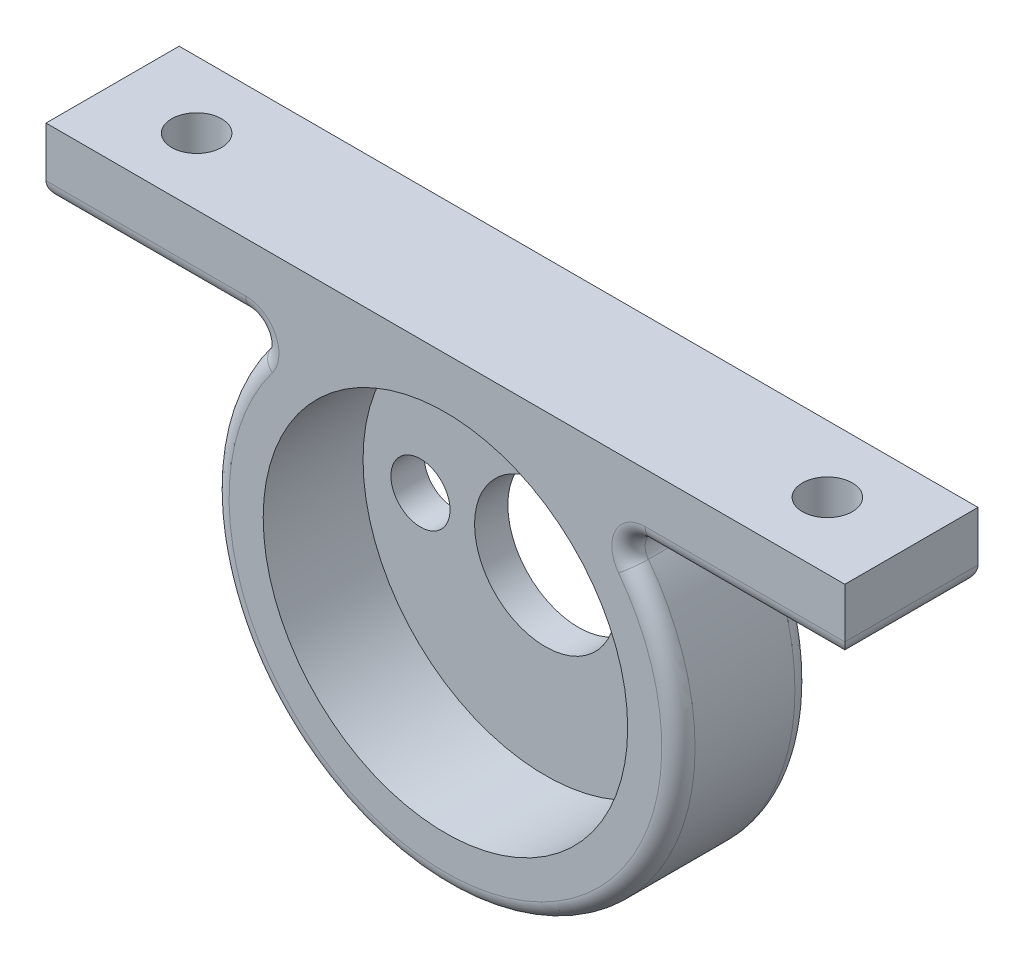
ISO-10303-21;
HEADER;
FILE_DESCRIPTION(('STEP AP214'),'2;1');
FILE_NAME('part.step','',(''),(''),'','','');
FILE_SCHEMA(('AUTOMOTIVE_DESIGN { 1 0 10303 214 1 1 1 1 }'));
ENDSEC;
DATA;
#1=APPLICATION_CONTEXT('core data for automotive mechanical design processes');
#2=APPLICATION_PROTOCOL_DEFINITION('international standard','automotive_design',2000,#1);
#3=PRODUCT_CONTEXT('',#1,'mechanical');
#4=PRODUCT('Part','Part','',(#3));
#5=PRODUCT_RELATED_PRODUCT_CATEGORY('part','',(#4));
#6=PRODUCT_DEFINITION_FORMATION('','',#4);
#7=PRODUCT_DEFINITION_CONTEXT('part definition',#1,'design');
#8=PRODUCT_DEFINITION('design','',#6,#7);
#9=PRODUCT_DEFINITION_SHAPE('','',#8);
#10=(LENGTH_UNIT() NAMED_UNIT(*) SI_UNIT(.MILLI.,.METRE.));
#11=(NAMED_UNIT(*) PLANE_ANGLE_UNIT() SI_UNIT($,.RADIAN.));
#12=(NAMED_UNIT(*) SI_UNIT($,.STERADIAN.) SOLID_ANGLE_UNIT());
#13=UNCERTAINTY_MEASURE_WITH_UNIT(LENGTH_MEASURE(1.E-05),#10,'distance_accuracy_value','');
#14=(GEOMETRIC_REPRESENTATION_CONTEXT(3) GLOBAL_UNCERTAINTY_ASSIGNED_CONTEXT((#13)) GLOBAL_UNIT_ASSIGNED_CONTEXT((#10,
#11,#12)) REPRESENTATION_CONTEXT('',''));
#15=CARTESIAN_POINT('',(0.,0.,0.));
#16=DIRECTION('',(0.,0.,1.));
#17=DIRECTION('',(1.,0.,0.));
#18=AXIS2_PLACEMENT_3D('',#15,#16,#17);
#19=CARTESIAN_POINT('',(0.,0.,8.));
#20=DIRECTION('',(0.,0.,-1.));
#21=DIRECTION('',(-1.,0.,0.));
#22=AXIS2_PLACEMENT_3D('',#19,#20,#21);
#23=CYLINDRICAL_SURFACE('',#22,14.);
#24=CARTESIAN_POINT('',(0.,0.,7.));
#25=DIRECTION('',(0.,0.,1.));
#26=DIRECTION('',(1.,0.,0.));
#27=AXIS2_PLACEMENT_3D('',#24,#25,#26);
#28=CIRCLE('',#27,14.);
#29=CARTESIAN_POINT('',(11.2,8.4,7.));
#30=VERTEX_POINT('',#29);
#31=CARTESIAN_POINT('',(-11.2,8.4,7.));
#32=VERTEX_POINT('',#31);
#33=EDGE_CURVE('E54',#30,#32,#28,.F.);
#34=ORIENTED_EDGE('',*,*,#33,.T.);
#35=DIRECTION('',(0.,0.,-1.));
#36=VECTOR('',#35,1.);
#37=CARTESIAN_POINT('',(-11.2,8.4,8.));
#38=LINE('',#37,#36);
#39=CARTESIAN_POINT('',(-11.2,8.4,1.));
#40=VERTEX_POINT('',#39);
#41=EDGE_CURVE('E209',#32,#40,#38,.T.);
#42=ORIENTED_EDGE('',*,*,#41,.T.);
#43=CARTESIAN_POINT('',(0.,0.,1.));
#44=DIRECTION('',(0.,0.,1.));
#45=DIRECTION('',(1.,0.,0.));
#46=AXIS2_PLACEMENT_3D('',#43,#44,#45);
#47=CIRCLE('',#46,14.);
#48=CARTESIAN_POINT('',(11.2,8.4,1.));
#49=VERTEX_POINT('',#48);
#50=EDGE_CURVE('E205',#40,#49,#47,.T.);
#51=ORIENTED_EDGE('',*,*,#50,.T.);
#52=DIRECTION('',(0.,0.,-1.));
#53=VECTOR('',#52,1.);
#54=CARTESIAN_POINT('',(11.2,8.4,8.));
#55=LINE('',#54,#53);
#56=EDGE_CURVE('E59',#49,#30,#55,.F.);
#57=ORIENTED_EDGE('',*,*,#56,.T.);
#58=EDGE_LOOP('',(#34,#42,#51,#57));
#59=FACE_BOUND('',#58,.T.);
#60=ADVANCED_FACE('F37',(#59),#23,.T.);
#61=CARTESIAN_POINT('',(24.,10.,8.));
#62=DIRECTION('',(0.,1.,0.));
#63=DIRECTION('',(-1.,0.,0.));
#64=AXIS2_PLACEMENT_3D('',#61,#62,#63);
#65=PLANE('',#64);
#66=CARTESIAN_POINT('',(18.9494897427832,10.,4.));
#67=DIRECTION('',(0.,-1.,0.));
#68=DIRECTION('',(0.,0.,-1.));
#69=AXIS2_PLACEMENT_3D('',#66,#67,#68);
#70=CIRCLE('',#69,1.5);
#71=CARTESIAN_POINT('',(18.9494897427832,10.,2.5));
#72=VERTEX_POINT('',#71);
#73=EDGE_CURVE('E281',#72,#72,#70,.T.);
#74=ORIENTED_EDGE('',*,*,#73,.F.);
#75=EDGE_LOOP('',(#74));
#76=FACE_BOUND('',#75,.T.);
#77=DIRECTION('',(1.,0.,0.));
#78=VECTOR('',#77,1.);
#79=CARTESIAN_POINT('',(9.79795897113272,9.99999999999999,7.));
#80=LINE('',#79,#78);
#81=CARTESIAN_POINT('',(23.,10.,7.));
#82=VERTEX_POINT('',#81);
#83=CARTESIAN_POINT('',(12.,9.99999999999999,7.));
#84=VERTEX_POINT('',#83);
#85=EDGE_CURVE('E200',#82,#84,#80,.F.);
#86=ORIENTED_EDGE('',*,*,#85,.T.);
#87=DIRECTION('',(0.,0.,1.));
#88=VECTOR('',#87,1.);
#89=CARTESIAN_POINT('',(12.,9.99999999999999,0.));
#90=LINE('',#89,#88);
#91=CARTESIAN_POINT('',(12.,9.99999999999999,1.));
#92=VERTEX_POINT('',#91);
#93=EDGE_CURVE('E203',#84,#92,#90,.F.);
#94=ORIENTED_EDGE('',*,*,#93,.T.);
#95=DIRECTION('',(1.,0.,0.));
#96=VECTOR('',#95,1.);
#97=CARTESIAN_POINT('',(24.,10.,1.));
#98=LINE('',#97,#96);
#99=CARTESIAN_POINT('',(23.,10.,1.));
#100=VERTEX_POINT('',#99);
#101=EDGE_CURVE('E198',#92,#100,#98,.T.);
#102=ORIENTED_EDGE('',*,*,#101,.T.);
#103=DIRECTION('',(0.,0.,-1.));
#104=VECTOR('',#103,1.);
#105=CARTESIAN_POINT('',(23.,10.,8.));
#106=LINE('',#105,#104);
#107=EDGE_CURVE('E196',#100,#82,#106,.F.);
#108=ORIENTED_EDGE('',*,*,#107,.T.);
#109=EDGE_LOOP('',(#86,#94,#102,#108));
#110=FACE_BOUND('',#109,.T.);
#111=ADVANCED_FACE('F344',(#76,#110),#65,.F.);
#112=CARTESIAN_POINT('',(24.,14.,8.));
#113=DIRECTION('',(-1.,0.,0.));
#114=DIRECTION('',(0.,0.,1.));
#115=AXIS2_PLACEMENT_3D('',#112,#113,#114);
#116=PLANE('',#115);
#117=DIRECTION('',(0.,1.,0.));
#118=VECTOR('',#117,1.);
#119=CARTESIAN_POINT('',(24.,14.,8.));
#120=LINE('',#119,#118);
#121=CARTESIAN_POINT('',(24.,11.,8.));
#122=VERTEX_POINT('',#121);
#123=CARTESIAN_POINT('',(24.,14.,8.));
#124=VERTEX_POINT('',#123);
#125=EDGE_CURVE('E138',#122,#124,#120,.T.);
#126=ORIENTED_EDGE('',*,*,#125,.F.);
#127=DIRECTION('',(0.,0.,-1.));
#128=VECTOR('',#127,1.);
#129=CARTESIAN_POINT('',(24.,11.,8.));
#130=LINE('',#129,#128);
#131=CARTESIAN_POINT('',(24.,11.,0.));
#132=VERTEX_POINT('',#131);
#133=EDGE_CURVE('E211',#122,#132,#130,.T.);
#134=ORIENTED_EDGE('',*,*,#133,.T.);
#135=DIRECTION('',(0.,1.,0.));
#136=VECTOR('',#135,1.);
#137=CARTESIAN_POINT('',(24.,14.,0.));
#138=LINE('',#137,#136);
#139=CARTESIAN_POINT('',(24.,14.,0.));
#140=VERTEX_POINT('',#139);
#141=EDGE_CURVE('E155',#132,#140,#138,.T.);
#142=ORIENTED_EDGE('',*,*,#141,.T.);
#143=DIRECTION('',(0.,0.,-1.));
#144=VECTOR('',#143,1.);
#145=CARTESIAN_POINT('',(24.,14.,8.));
#146=LINE('',#145,#144);
#147=EDGE_CURVE('E152',#124,#140,#146,.T.);
#148=ORIENTED_EDGE('',*,*,#147,.F.);
#149=EDGE_LOOP('',(#126,#134,#142,#148));
#150=FACE_BOUND('',#149,.T.);
#151=ADVANCED_FACE('F153',(#150),#116,.F.);
#152=CARTESIAN_POINT('',(0.,14.,8.));
#153=DIRECTION('',(0.,-1.,0.));
#154=DIRECTION('',(1.,0.,0.));
#155=AXIS2_PLACEMENT_3D('',#152,#153,#154);
#156=PLANE('',#155);
#157=CARTESIAN_POINT('',(18.9494897427832,14.,4.));
#158=DIRECTION('',(0.,-1.,0.));
#159=DIRECTION('',(0.,0.,-1.));
#160=AXIS2_PLACEMENT_3D('',#157,#158,#159);
#161=CIRCLE('',#160,1.5);
#162=CARTESIAN_POINT('',(18.9494897427832,14.,2.5));
#163=VERTEX_POINT('',#162);
#164=EDGE_CURVE('E285',#163,#163,#161,.T.);
#165=ORIENTED_EDGE('',*,*,#164,.T.);
#166=EDGE_LOOP('',(#165));
#167=FACE_BOUND('',#166,.T.);
#168=CARTESIAN_POINT('',(-18.9494897427832,14.,4.));
#169=DIRECTION('',(0.,-1.,0.));
#170=DIRECTION('',(0.,0.,-1.));
#171=AXIS2_PLACEMENT_3D('',#168,#169,#170);
#172=CIRCLE('',#171,1.5);
#173=CARTESIAN_POINT('',(-18.9494897427832,14.,2.5));
#174=VERTEX_POINT('',#173);
#175=EDGE_CURVE('E223',#174,#174,#172,.T.);
#176=ORIENTED_EDGE('',*,*,#175,.T.);
#177=EDGE_LOOP('',(#176));
#178=FACE_BOUND('',#177,.T.);
#179=DIRECTION('',(-1.,0.,0.));
#180=VECTOR('',#179,1.);
#181=CARTESIAN_POINT('',(0.,14.,0.));
#182=LINE('',#181,#180);
#183=CARTESIAN_POINT('',(-24.,14.,0.));
#184=VERTEX_POINT('',#183);
#185=EDGE_CURVE('E170',#140,#184,#182,.T.);
#186=ORIENTED_EDGE('',*,*,#185,.T.);
#187=DIRECTION('',(0.,0.,-1.));
#188=VECTOR('',#187,1.);
#189=CARTESIAN_POINT('',(-24.,14.,8.));
#190=LINE('',#189,#188);
#191=CARTESIAN_POINT('',(-24.,14.,8.));
#192=VERTEX_POINT('',#191);
#193=EDGE_CURVE('E159',#192,#184,#190,.T.);
#194=ORIENTED_EDGE('',*,*,#193,.F.);
#195=DIRECTION('',(-1.,0.,0.));
#196=VECTOR('',#195,1.);
#197=CARTESIAN_POINT('',(0.,14.,8.));
#198=LINE('',#197,#196);
#199=EDGE_CURVE('E143',#124,#192,#198,.T.);
#200=ORIENTED_EDGE('',*,*,#199,.F.);
#201=ORIENTED_EDGE('',*,*,#147,.T.);
#202=EDGE_LOOP('',(#186,#194,#200,#201));
#203=FACE_BOUND('',#202,.T.);
#204=ADVANCED_FACE('F161',(#167,#178,#203),#156,.F.);
#205=CARTESIAN_POINT('',(-24.,14.,8.));
#206=DIRECTION('',(1.,0.,0.));
#207=DIRECTION('',(0.,0.,-1.));
#208=AXIS2_PLACEMENT_3D('',#205,#206,#207);
#209=PLANE('',#208);
#210=DIRECTION('',(0.,-1.,0.));
#211=VECTOR('',#210,1.);
#212=CARTESIAN_POINT('',(-24.,14.,0.));
#213=LINE('',#212,#211);
#214=CARTESIAN_POINT('',(-24.,11.,0.));
#215=VERTEX_POINT('',#214);
#216=EDGE_CURVE('E149',#184,#215,#213,.T.);
#217=ORIENTED_EDGE('',*,*,#216,.T.);
#218=DIRECTION('',(0.,0.,-1.));
#219=VECTOR('',#218,1.);
#220=CARTESIAN_POINT('',(-24.,11.,8.));
#221=LINE('',#220,#219);
#222=CARTESIAN_POINT('',(-24.,11.,8.));
#223=VERTEX_POINT('',#222);
#224=EDGE_CURVE('E213',#215,#223,#221,.F.);
#225=ORIENTED_EDGE('',*,*,#224,.T.);
#226=DIRECTION('',(0.,-1.,0.));
#227=VECTOR('',#226,1.);
#228=CARTESIAN_POINT('',(-24.,14.,8.));
#229=LINE('',#228,#227);
#230=EDGE_CURVE('E164',#192,#223,#229,.T.);
#231=ORIENTED_EDGE('',*,*,#230,.F.);
#232=ORIENTED_EDGE('',*,*,#193,.T.);
#233=EDGE_LOOP('',(#217,#225,#231,#232));
#234=FACE_BOUND('',#233,.T.);
#235=ADVANCED_FACE('F300',(#234),#209,.F.);
#236=CARTESIAN_POINT('',(-24.,10.,8.));
#237=DIRECTION('',(0.,1.,0.));
#238=DIRECTION('',(0.,0.,1.));
#239=AXIS2_PLACEMENT_3D('',#236,#237,#238);
#240=PLANE('',#239);
#241=CARTESIAN_POINT('',(-18.9494897427832,10.,4.));
#242=DIRECTION('',(0.,-1.,0.));
#243=DIRECTION('',(0.,0.,-1.));
#244=AXIS2_PLACEMENT_3D('',#241,#242,#243);
#245=CIRCLE('',#244,1.5);
#246=CARTESIAN_POINT('',(-18.9494897427832,10.,2.5));
#247=VERTEX_POINT('',#246);
#248=EDGE_CURVE('E288',#247,#247,#245,.T.);
#249=ORIENTED_EDGE('',*,*,#248,.F.);
#250=EDGE_LOOP('',(#249));
#251=FACE_BOUND('',#250,.T.);
#252=DIRECTION('',(1.,0.,0.));
#253=VECTOR('',#252,1.);
#254=CARTESIAN_POINT('',(-24.,10.,1.));
#255=LINE('',#254,#253);
#256=CARTESIAN_POINT('',(-23.,10.,1.));
#257=VERTEX_POINT('',#256);
#258=CARTESIAN_POINT('',(-12.,10.,1.));
#259=VERTEX_POINT('',#258);
#260=EDGE_CURVE('E183',#257,#259,#255,.T.);
#261=ORIENTED_EDGE('',*,*,#260,.T.);
#262=DIRECTION('',(0.,0.,1.));
#263=VECTOR('',#262,1.);
#264=CARTESIAN_POINT('',(-12.,10.,8.));
#265=LINE('',#264,#263);
#266=CARTESIAN_POINT('',(-12.,10.,7.));
#267=VERTEX_POINT('',#266);
#268=EDGE_CURVE('E188',#259,#267,#265,.T.);
#269=ORIENTED_EDGE('',*,*,#268,.T.);
#270=DIRECTION('',(1.,0.,0.));
#271=VECTOR('',#270,1.);
#272=CARTESIAN_POINT('',(-24.,10.,7.));
#273=LINE('',#272,#271);
#274=CARTESIAN_POINT('',(-23.,10.,7.));
#275=VERTEX_POINT('',#274);
#276=EDGE_CURVE('E185',#267,#275,#273,.F.);
#277=ORIENTED_EDGE('',*,*,#276,.T.);
#278=DIRECTION('',(0.,0.,-1.));
#279=VECTOR('',#278,1.);
#280=CARTESIAN_POINT('',(-23.,10.,8.));
#281=LINE('',#280,#279);
#282=EDGE_CURVE('E181',#275,#257,#281,.T.);
#283=ORIENTED_EDGE('',*,*,#282,.T.);
#284=EDGE_LOOP('',(#261,#269,#277,#283));
#285=FACE_BOUND('',#284,.T.);
#286=ADVANCED_FACE('F297',(#251,#285),#240,.F.);
#287=CARTESIAN_POINT('',(0.,0.,8.));
#288=DIRECTION('',(0.,0.,1.));
#289=DIRECTION('',(1.,0.,0.));
#290=AXIS2_PLACEMENT_3D('',#287,#288,#289);
#291=PLANE('',#290);
#292=CARTESIAN_POINT('',(0.,0.,8.));
#293=DIRECTION('',(0.,0.,1.));
#294=DIRECTION('',(1.,0.,0.));
#295=AXIS2_PLACEMENT_3D('',#292,#293,#294);
#296=CIRCLE('',#295,10.95);
#297=CARTESIAN_POINT('',(10.95,0.,8.));
#298=VERTEX_POINT('',#297);
#299=EDGE_CURVE('E272',#298,#298,#296,.T.);
#300=ORIENTED_EDGE('',*,*,#299,.F.);
#301=EDGE_LOOP('',(#300));
#302=FACE_BOUND('',#301,.T.);
#303=CARTESIAN_POINT('',(0.,0.,8.));
#304=DIRECTION('',(0.,0.,1.));
#305=DIRECTION('',(1.,0.,0.));
#306=AXIS2_PLACEMENT_3D('',#303,#304,#305);
#307=CIRCLE('',#306,13.);
#308=CARTESIAN_POINT('',(-10.4,7.8,8.));
#309=VERTEX_POINT('',#308);
#310=CARTESIAN_POINT('',(10.4,7.8,8.));
#311=VERTEX_POINT('',#310);
#312=EDGE_CURVE('E158',#309,#311,#307,.T.);
#313=ORIENTED_EDGE('',*,*,#312,.T.);
#314=CARTESIAN_POINT('',(12.,9.,8.));
#315=DIRECTION('',(0.,0.,1.));
#316=DIRECTION('',(1.,0.,0.));
#317=AXIS2_PLACEMENT_3D('',#314,#315,#316);
#318=CIRCLE('',#317,2.);
#319=CARTESIAN_POINT('',(12.,11.,8.));
#320=VERTEX_POINT('',#319);
#321=EDGE_CURVE('E46',#311,#320,#318,.F.);
#322=ORIENTED_EDGE('',*,*,#321,.T.);
#323=DIRECTION('',(1.,0.,0.));
#324=VECTOR('',#323,1.);
#325=CARTESIAN_POINT('',(24.,11.,8.));
#326=LINE('',#325,#324);
#327=EDGE_CURVE('E146',#320,#122,#326,.T.);
#328=ORIENTED_EDGE('',*,*,#327,.T.);
#329=ORIENTED_EDGE('',*,*,#125,.T.);
#330=ORIENTED_EDGE('',*,*,#199,.T.);
#331=ORIENTED_EDGE('',*,*,#230,.T.);
#332=DIRECTION('',(1.,0.,0.));
#333=VECTOR('',#332,1.);
#334=CARTESIAN_POINT('',(-9.79795897113272,11.,8.));
#335=LINE('',#334,#333);
#336=CARTESIAN_POINT('',(-12.,11.,8.));
#337=VERTEX_POINT('',#336);
#338=EDGE_CURVE('E178',#223,#337,#335,.T.);
#339=ORIENTED_EDGE('',*,*,#338,.T.);
#340=CARTESIAN_POINT('',(-12.,9.,8.));
#341=DIRECTION('',(0.,0.,1.));
#342=DIRECTION('',(1.,0.,0.));
#343=AXIS2_PLACEMENT_3D('',#340,#341,#342);
#344=CIRCLE('',#343,2.);
#345=EDGE_CURVE('E215',#337,#309,#344,.F.);
#346=ORIENTED_EDGE('',*,*,#345,.T.);
#347=EDGE_LOOP('',(#313,#322,#328,#329,#330,#331,#339,#346));
#348=FACE_BOUND('',#347,.T.);
#349=ADVANCED_FACE('F140',(#302,#348),#291,.T.);
#350=CARTESIAN_POINT('',(0.,0.,0.));
#351=DIRECTION('',(0.,0.,1.));
#352=DIRECTION('',(1.,0.,0.));
#353=AXIS2_PLACEMENT_3D('',#350,#351,#352);
#354=PLANE('',#353);
#355=CARTESIAN_POINT('',(7.5,0.,0.));
#356=DIRECTION('',(0.,0.,-1.));
#357=DIRECTION('',(-1.,0.,0.));
#358=AXIS2_PLACEMENT_3D('',#355,#356,#357);
#359=CIRCLE('',#358,1.775);
#360=CARTESIAN_POINT('',(5.725,0.,0.));
#361=VERTEX_POINT('',#360);
#362=EDGE_CURVE('E632',#361,#361,#359,.T.);
#363=ORIENTED_EDGE('',*,*,#362,.F.);
#364=EDGE_LOOP('',(#363));
#365=FACE_BOUND('',#364,.T.);
#366=CARTESIAN_POINT('',(-7.5,0.,0.));
#367=DIRECTION('',(0.,0.,-1.));
#368=DIRECTION('',(-1.,0.,0.));
#369=AXIS2_PLACEMENT_3D('',#366,#367,#368);
#370=CIRCLE('',#369,1.775);
#371=CARTESIAN_POINT('',(-9.275,0.,0.));
#372=VERTEX_POINT('',#371);
#373=EDGE_CURVE('E633',#372,#372,#370,.T.);
#374=ORIENTED_EDGE('',*,*,#373,.F.);
#375=EDGE_LOOP('',(#374));
#376=FACE_BOUND('',#375,.T.);
#377=CARTESIAN_POINT('',(0.,0.,0.));
#378=DIRECTION('',(0.,0.,-1.));
#379=DIRECTION('',(-1.,0.,0.));
#380=AXIS2_PLACEMENT_3D('',#377,#378,#379);
#381=CIRCLE('',#380,4.25);
#382=CARTESIAN_POINT('',(-4.25,0.,0.));
#383=VERTEX_POINT('',#382);
#384=EDGE_CURVE('E267',#383,#383,#381,.T.);
#385=ORIENTED_EDGE('',*,*,#384,.F.);
#386=EDGE_LOOP('',(#385));
#387=FACE_BOUND('',#386,.T.);
#388=CARTESIAN_POINT('',(0.,0.,0.));
#389=DIRECTION('',(0.,0.,1.));
#390=DIRECTION('',(1.,0.,0.));
#391=AXIS2_PLACEMENT_3D('',#388,#389,#390);
#392=CIRCLE('',#391,13.);
#393=CARTESIAN_POINT('',(10.4,7.8,0.));
#394=VERTEX_POINT('',#393);
#395=CARTESIAN_POINT('',(-10.4,7.8,0.));
#396=VERTEX_POINT('',#395);
#397=EDGE_CURVE('E190',#394,#396,#392,.F.);
#398=ORIENTED_EDGE('',*,*,#397,.T.);
#399=CARTESIAN_POINT('',(-12.,9.,0.));
#400=DIRECTION('',(0.,0.,1.));
#401=DIRECTION('',(1.,0.,0.));
#402=AXIS2_PLACEMENT_3D('',#399,#400,#401);
#403=CIRCLE('',#402,2.);
#404=CARTESIAN_POINT('',(-12.,11.,0.));
#405=VERTEX_POINT('',#404);
#406=EDGE_CURVE('E11',#396,#405,#403,.T.);
#407=ORIENTED_EDGE('',*,*,#406,.T.);
#408=DIRECTION('',(1.,0.,0.));
#409=VECTOR('',#408,1.);
#410=CARTESIAN_POINT('',(0.,11.,0.));
#411=LINE('',#410,#409);
#412=EDGE_CURVE('E194',#405,#215,#411,.F.);
#413=ORIENTED_EDGE('',*,*,#412,.T.);
#414=ORIENTED_EDGE('',*,*,#216,.F.);
#415=ORIENTED_EDGE('',*,*,#185,.F.);
#416=ORIENTED_EDGE('',*,*,#141,.F.);
#417=DIRECTION('',(1.,0.,0.));
#418=VECTOR('',#417,1.);
#419=CARTESIAN_POINT('',(0.,11.,0.));
#420=LINE('',#419,#418);
#421=CARTESIAN_POINT('',(12.,11.,0.));
#422=VERTEX_POINT('',#421);
#423=EDGE_CURVE('E192',#132,#422,#420,.F.);
#424=ORIENTED_EDGE('',*,*,#423,.T.);
#425=CARTESIAN_POINT('',(12.,9.,0.));
#426=DIRECTION('',(0.,0.,1.));
#427=DIRECTION('',(1.,0.,0.));
#428=AXIS2_PLACEMENT_3D('',#425,#426,#427);
#429=CIRCLE('',#428,2.);
#430=EDGE_CURVE('E217',#422,#394,#429,.T.);
#431=ORIENTED_EDGE('',*,*,#430,.T.);
#432=EDGE_LOOP('',(#398,#407,#413,#414,#415,#416,#424,#431));
#433=FACE_BOUND('',#432,.T.);
#434=ADVANCED_FACE('F336',(#365,#376,#387,#433),#354,.F.);
#435=CARTESIAN_POINT('',(24.,11.,1.));
#436=DIRECTION('',(1.,0.,0.));
#437=DIRECTION('',(0.,1.,0.));
#438=AXIS2_PLACEMENT_3D('',#435,#436,#437);
#439=CYLINDRICAL_SURFACE('',#438,1.);
#440=CARTESIAN_POINT('',(12.,11.,1.));
#441=DIRECTION('',(-1.,0.,0.));
#442=DIRECTION('',(0.,0.,1.));
#443=AXIS2_PLACEMENT_3D('',#440,#441,#442);
#444=CIRCLE('',#443,1.);
#445=EDGE_CURVE('E259',#422,#92,#444,.T.);
#446=ORIENTED_EDGE('',*,*,#445,.F.);
#447=ORIENTED_EDGE('',*,*,#423,.F.);
#448=CARTESIAN_POINT('',(23.,11.,1.));
#449=DIRECTION('',(-0.707106781186547,0.,-0.707106781186547));
#450=DIRECTION('',(0.707106781186547,0.,-0.707106781186547));
#451=AXIS2_PLACEMENT_3D('',#448,#449,#450);
#452=ELLIPSE('',#451,1.41421356237309,1.);
#453=EDGE_CURVE('E171',#100,#132,#452,.F.);
#454=ORIENTED_EDGE('',*,*,#453,.F.);
#455=ORIENTED_EDGE('',*,*,#101,.F.);
#456=EDGE_LOOP('',(#446,#447,#454,#455));
#457=FACE_BOUND('',#456,.T.);
#458=ADVANCED_FACE('F39',(#457),#439,.T.);
#459=CARTESIAN_POINT('',(23.,11.,8.));
#460=DIRECTION('',(0.,0.,-1.));
#461=DIRECTION('',(-1.,0.,0.));
#462=AXIS2_PLACEMENT_3D('',#459,#460,#461);
#463=CYLINDRICAL_SURFACE('',#462,1.);
#464=ORIENTED_EDGE('',*,*,#453,.T.);
#465=ORIENTED_EDGE('',*,*,#133,.F.);
#466=CARTESIAN_POINT('',(23.,11.,7.));
#467=DIRECTION('',(0.707106781186547,0.,-0.707106781186547));
#468=DIRECTION('',(-0.707106781186547,0.,-0.707106781186547));
#469=AXIS2_PLACEMENT_3D('',#466,#467,#468);
#470=ELLIPSE('',#469,1.41421356237309,1.);
#471=EDGE_CURVE('E256',#82,#122,#470,.F.);
#472=ORIENTED_EDGE('',*,*,#471,.F.);
#473=ORIENTED_EDGE('',*,*,#107,.F.);
#474=EDGE_LOOP('',(#464,#465,#472,#473));
#475=FACE_BOUND('',#474,.T.);
#476=ADVANCED_FACE('F385',(#475),#463,.T.);
#477=CARTESIAN_POINT('',(12.,9.,1.));
#478=DIRECTION('',(0.,0.,1.));
#479=DIRECTION('',(1.,0.,0.));
#480=AXIS2_PLACEMENT_3D('',#477,#478,#479);
#481=TOROIDAL_SURFACE('',#480,2.,1.);
#482=ORIENTED_EDGE('',*,*,#430,.F.);
#483=ORIENTED_EDGE('',*,*,#445,.T.);
#484=CARTESIAN_POINT('',(12.,9.,1.));
#485=DIRECTION('',(0.,0.,1.));
#486=DIRECTION('',(1.,0.,0.));
#487=AXIS2_PLACEMENT_3D('',#484,#485,#486);
#488=CIRCLE('',#487,1.);
#489=EDGE_CURVE('E253',#49,#92,#488,.F.);
#490=ORIENTED_EDGE('',*,*,#489,.F.);
#491=CARTESIAN_POINT('',(10.4,7.8,1.));
#492=DIRECTION('',(-0.6,0.8,0.));
#493=DIRECTION('',(-0.8,-0.6,0.));
#494=AXIS2_PLACEMENT_3D('',#491,#492,#493);
#495=CIRCLE('',#494,1.);
#496=EDGE_CURVE('E250',#394,#49,#495,.F.);
#497=ORIENTED_EDGE('',*,*,#496,.F.);
#498=EDGE_LOOP('',(#482,#483,#490,#497));
#499=FACE_BOUND('',#498,.T.);
#500=ADVANCED_FACE('F382',(#499),#481,.T.);
#501=CARTESIAN_POINT('',(0.,11.,7.));
#502=DIRECTION('',(-1.,0.,0.));
#503=DIRECTION('',(0.,-1.,0.));
#504=AXIS2_PLACEMENT_3D('',#501,#502,#503);
#505=CYLINDRICAL_SURFACE('',#504,1.);
#506=ORIENTED_EDGE('',*,*,#471,.T.);
#507=ORIENTED_EDGE('',*,*,#327,.F.);
#508=CARTESIAN_POINT('',(12.,11.,7.));
#509=DIRECTION('',(-1.,0.,0.));
#510=DIRECTION('',(0.,0.,1.));
#511=AXIS2_PLACEMENT_3D('',#508,#509,#510);
#512=CIRCLE('',#511,1.);
#513=EDGE_CURVE('E247',#84,#320,#512,.T.);
#514=ORIENTED_EDGE('',*,*,#513,.F.);
#515=ORIENTED_EDGE('',*,*,#85,.F.);
#516=EDGE_LOOP('',(#506,#507,#514,#515));
#517=FACE_BOUND('',#516,.T.);
#518=ADVANCED_FACE('F378',(#517),#505,.T.);
#519=CARTESIAN_POINT('',(12.,9.,8.));
#520=DIRECTION('',(0.,0.,-1.));
#521=DIRECTION('',(-1.,0.,0.));
#522=AXIS2_PLACEMENT_3D('',#519,#520,#521);
#523=CYLINDRICAL_SURFACE('',#522,1.);
#524=ORIENTED_EDGE('',*,*,#489,.T.);
#525=ORIENTED_EDGE('',*,*,#93,.F.);
#526=CARTESIAN_POINT('',(12.,9.,7.));
#527=DIRECTION('',(0.,0.,1.));
#528=DIRECTION('',(1.,0.,0.));
#529=AXIS2_PLACEMENT_3D('',#526,#527,#528);
#530=CIRCLE('',#529,1.);
#531=EDGE_CURVE('E245',#30,#84,#530,.F.);
#532=ORIENTED_EDGE('',*,*,#531,.F.);
#533=ORIENTED_EDGE('',*,*,#56,.F.);
#534=EDGE_LOOP('',(#524,#525,#532,#533));
#535=FACE_BOUND('',#534,.T.);
#536=ADVANCED_FACE('F375',(#535),#523,.F.);
#537=CARTESIAN_POINT('',(0.,0.,1.));
#538=DIRECTION('',(0.,0.,1.));
#539=DIRECTION('',(1.,0.,0.));
#540=AXIS2_PLACEMENT_3D('',#537,#538,#539);
#541=TOROIDAL_SURFACE('',#540,13.,1.);
#542=ORIENTED_EDGE('',*,*,#496,.T.);
#543=ORIENTED_EDGE('',*,*,#50,.F.);
#544=CARTESIAN_POINT('',(-10.4,7.8,1.));
#545=DIRECTION('',(0.6,0.8,0.));
#546=DIRECTION('',(-0.8,0.6,0.));
#547=AXIS2_PLACEMENT_3D('',#544,#545,#546);
#548=CIRCLE('',#547,1.);
#549=EDGE_CURVE('E242',#396,#40,#548,.T.);
#550=ORIENTED_EDGE('',*,*,#549,.F.);
#551=ORIENTED_EDGE('',*,*,#397,.F.);
#552=EDGE_LOOP('',(#542,#543,#550,#551));
#553=FACE_BOUND('',#552,.T.);
#554=ADVANCED_FACE('F341',(#553),#541,.T.);
#555=CARTESIAN_POINT('',(12.,9.,7.));
#556=DIRECTION('',(0.,0.,1.));
#557=DIRECTION('',(1.,0.,0.));
#558=AXIS2_PLACEMENT_3D('',#555,#556,#557);
#559=TOROIDAL_SURFACE('',#558,2.,1.);
#560=ORIENTED_EDGE('',*,*,#513,.T.);
#561=ORIENTED_EDGE('',*,*,#321,.F.);
#562=CARTESIAN_POINT('',(10.4,7.8,7.));
#563=DIRECTION('',(-0.6,0.8,0.));
#564=DIRECTION('',(-0.8,-0.6,0.));
#565=AXIS2_PLACEMENT_3D('',#562,#563,#564);
#566=CIRCLE('',#565,1.);
#567=EDGE_CURVE('E236',#30,#311,#566,.F.);
#568=ORIENTED_EDGE('',*,*,#567,.F.);
#569=ORIENTED_EDGE('',*,*,#531,.T.);
#570=EDGE_LOOP('',(#560,#561,#568,#569));
#571=FACE_BOUND('',#570,.T.);
#572=ADVANCED_FACE('F369',(#571),#559,.T.);
#573=CARTESIAN_POINT('',(-12.,9.,1.));
#574=DIRECTION('',(0.,0.,1.));
#575=DIRECTION('',(1.,0.,0.));
#576=AXIS2_PLACEMENT_3D('',#573,#574,#575);
#577=TOROIDAL_SURFACE('',#576,2.,1.);
#578=CARTESIAN_POINT('',(-12.,9.,1.));
#579=DIRECTION('',(0.,0.,1.));
#580=DIRECTION('',(1.,0.,0.));
#581=AXIS2_PLACEMENT_3D('',#578,#579,#580);
#582=CIRCLE('',#581,1.);
#583=EDGE_CURVE('E234',#259,#40,#582,.F.);
#584=ORIENTED_EDGE('',*,*,#583,.F.);
#585=CARTESIAN_POINT('',(-12.,11.,1.));
#586=DIRECTION('',(1.,0.,0.));
#587=DIRECTION('',(0.,0.,-1.));
#588=AXIS2_PLACEMENT_3D('',#585,#586,#587);
#589=CIRCLE('',#588,1.);
#590=EDGE_CURVE('E239',#405,#259,#589,.F.);
#591=ORIENTED_EDGE('',*,*,#590,.F.);
#592=ORIENTED_EDGE('',*,*,#406,.F.);
#593=ORIENTED_EDGE('',*,*,#549,.T.);
#594=EDGE_LOOP('',(#584,#591,#592,#593));
#595=FACE_BOUND('',#594,.T.);
#596=ADVANCED_FACE('F314',(#595),#577,.T.);
#597=CARTESIAN_POINT('',(-24.,11.,1.));
#598=DIRECTION('',(1.,0.,0.));
#599=DIRECTION('',(0.,0.,-1.));
#600=AXIS2_PLACEMENT_3D('',#597,#598,#599);
#601=CYLINDRICAL_SURFACE('',#600,1.);
#602=ORIENTED_EDGE('',*,*,#590,.T.);
#603=ORIENTED_EDGE('',*,*,#260,.F.);
#604=CARTESIAN_POINT('',(-23.,11.,1.));
#605=DIRECTION('',(0.707106781186547,0.,-0.707106781186547));
#606=DIRECTION('',(-0.707106781186547,0.,-0.707106781186547));
#607=AXIS2_PLACEMENT_3D('',#604,#605,#606);
#608=ELLIPSE('',#607,1.41421356237309,1.);
#609=EDGE_CURVE('E231',#215,#257,#608,.F.);
#610=ORIENTED_EDGE('',*,*,#609,.F.);
#611=ORIENTED_EDGE('',*,*,#412,.F.);
#612=EDGE_LOOP('',(#602,#603,#610,#611));
#613=FACE_BOUND('',#612,.T.);
#614=ADVANCED_FACE('F311',(#613),#601,.T.);
#615=CARTESIAN_POINT('',(0.,0.,7.));
#616=DIRECTION('',(0.,0.,1.));
#617=DIRECTION('',(1.,0.,0.));
#618=AXIS2_PLACEMENT_3D('',#615,#616,#617);
#619=TOROIDAL_SURFACE('',#618,13.,1.);
#620=ORIENTED_EDGE('',*,*,#567,.T.);
#621=ORIENTED_EDGE('',*,*,#312,.F.);
#622=CARTESIAN_POINT('',(-10.4,7.8,7.));
#623=DIRECTION('',(0.6,0.8,0.));
#624=DIRECTION('',(-0.8,0.6,0.));
#625=AXIS2_PLACEMENT_3D('',#622,#623,#624);
#626=CIRCLE('',#625,1.);
#627=EDGE_CURVE('E228',#32,#309,#626,.T.);
#628=ORIENTED_EDGE('',*,*,#627,.F.);
#629=ORIENTED_EDGE('',*,*,#33,.F.);
#630=EDGE_LOOP('',(#620,#621,#628,#629));
#631=FACE_BOUND('',#630,.T.);
#632=ADVANCED_FACE('F361',(#631),#619,.T.);
#633=CARTESIAN_POINT('',(-12.,9.,8.));
#634=DIRECTION('',(0.,0.,-1.));
#635=DIRECTION('',(-1.,0.,0.));
#636=AXIS2_PLACEMENT_3D('',#633,#634,#635);
#637=CYLINDRICAL_SURFACE('',#636,1.);
#638=ORIENTED_EDGE('',*,*,#583,.T.);
#639=ORIENTED_EDGE('',*,*,#41,.F.);
#640=CARTESIAN_POINT('',(-12.,9.,7.));
#641=DIRECTION('',(0.,0.,1.));
#642=DIRECTION('',(1.,0.,0.));
#643=AXIS2_PLACEMENT_3D('',#640,#641,#642);
#644=CIRCLE('',#643,1.);
#645=EDGE_CURVE('E225',#267,#32,#644,.F.);
#646=ORIENTED_EDGE('',*,*,#645,.F.);
#647=ORIENTED_EDGE('',*,*,#268,.F.);
#648=EDGE_LOOP('',(#638,#639,#646,#647));
#649=FACE_BOUND('',#648,.T.);
#650=ADVANCED_FACE('F318',(#649),#637,.F.);
#651=CARTESIAN_POINT('',(-23.,11.,8.));
#652=DIRECTION('',(0.,0.,-1.));
#653=DIRECTION('',(-1.,0.,0.));
#654=AXIS2_PLACEMENT_3D('',#651,#652,#653);
#655=CYLINDRICAL_SURFACE('',#654,1.);
#656=ORIENTED_EDGE('',*,*,#609,.T.);
#657=ORIENTED_EDGE('',*,*,#282,.F.);
#658=CARTESIAN_POINT('',(-23.,11.,7.));
#659=DIRECTION('',(-0.707106781186547,0.,-0.707106781186547));
#660=DIRECTION('',(0.707106781186547,0.,-0.707106781186547));
#661=AXIS2_PLACEMENT_3D('',#658,#659,#660);
#662=ELLIPSE('',#661,1.41421356237309,1.);
#663=EDGE_CURVE('E222',#223,#275,#662,.F.);
#664=ORIENTED_EDGE('',*,*,#663,.F.);
#665=ORIENTED_EDGE('',*,*,#224,.F.);
#666=EDGE_LOOP('',(#656,#657,#664,#665));
#667=FACE_BOUND('',#666,.T.);
#668=ADVANCED_FACE('F333',(#667),#655,.T.);
#669=CARTESIAN_POINT('',(-12.,9.,7.));
#670=DIRECTION('',(0.,0.,1.));
#671=DIRECTION('',(1.,0.,0.));
#672=AXIS2_PLACEMENT_3D('',#669,#670,#671);
#673=TOROIDAL_SURFACE('',#672,2.,1.);
#674=ORIENTED_EDGE('',*,*,#627,.T.);
#675=ORIENTED_EDGE('',*,*,#345,.F.);
#676=CARTESIAN_POINT('',(-12.,11.,7.));
#677=DIRECTION('',(1.,0.,0.));
#678=DIRECTION('',(0.,0.,-1.));
#679=AXIS2_PLACEMENT_3D('',#676,#677,#678);
#680=CIRCLE('',#679,1.);
#681=EDGE_CURVE('E220',#267,#337,#680,.F.);
#682=ORIENTED_EDGE('',*,*,#681,.F.);
#683=ORIENTED_EDGE('',*,*,#645,.T.);
#684=EDGE_LOOP('',(#674,#675,#682,#683));
#685=FACE_BOUND('',#684,.T.);
#686=ADVANCED_FACE('F328',(#685),#673,.T.);
#687=CARTESIAN_POINT('',(0.,11.,7.));
#688=DIRECTION('',(-1.,0.,0.));
#689=DIRECTION('',(0.,0.,1.));
#690=AXIS2_PLACEMENT_3D('',#687,#688,#689);
#691=CYLINDRICAL_SURFACE('',#690,1.);
#692=ORIENTED_EDGE('',*,*,#663,.T.);
#693=ORIENTED_EDGE('',*,*,#276,.F.);
#694=ORIENTED_EDGE('',*,*,#681,.T.);
#695=ORIENTED_EDGE('',*,*,#338,.F.);
#696=EDGE_LOOP('',(#692,#693,#694,#695));
#697=FACE_BOUND('',#696,.T.);
#698=ADVANCED_FACE('F324',(#697),#691,.T.);
#699=CARTESIAN_POINT('',(-18.9494897427832,14.,4.));
#700=DIRECTION('',(0.,-1.,0.));
#701=DIRECTION('',(0.,0.,-1.));
#702=AXIS2_PLACEMENT_3D('',#699,#700,#701);
#703=CYLINDRICAL_SURFACE('',#702,1.5);
#704=ORIENTED_EDGE('',*,*,#175,.F.);
#705=EDGE_LOOP('',(#704));
#706=FACE_BOUND('',#705,.T.);
#707=ORIENTED_EDGE('',*,*,#248,.T.);
#708=EDGE_LOOP('',(#707));
#709=FACE_BOUND('',#708,.T.);
#710=ADVANCED_FACE('F295',(#706,#709),#703,.F.);
#711=CARTESIAN_POINT('',(18.9494897427832,14.,4.));
#712=DIRECTION('',(0.,-1.,0.));
#713=DIRECTION('',(0.,0.,-1.));
#714=AXIS2_PLACEMENT_3D('',#711,#712,#713);
#715=CYLINDRICAL_SURFACE('',#714,1.5);
#716=ORIENTED_EDGE('',*,*,#164,.F.);
#717=EDGE_LOOP('',(#716));
#718=FACE_BOUND('',#717,.T.);
#719=ORIENTED_EDGE('',*,*,#73,.T.);
#720=EDGE_LOOP('',(#719));
#721=FACE_BOUND('',#720,.T.);
#722=ADVANCED_FACE('F452',(#718,#721),#715,.F.);
#723=CARTESIAN_POINT('',(0.,0.,2.));
#724=DIRECTION('',(0.,0.,1.));
#725=DIRECTION('',(1.,0.,0.));
#726=AXIS2_PLACEMENT_3D('',#723,#724,#725);
#727=CYLINDRICAL_SURFACE('',#726,10.95);
#728=CARTESIAN_POINT('',(0.,0.,2.));
#729=DIRECTION('',(0.,0.,1.));
#730=DIRECTION('',(1.,0.,0.));
#731=AXIS2_PLACEMENT_3D('',#728,#729,#730);
#732=CIRCLE('',#731,10.95);
#733=CARTESIAN_POINT('',(10.95,0.,2.));
#734=VERTEX_POINT('',#733);
#735=EDGE_CURVE('E276',#734,#734,#732,.T.);
#736=ORIENTED_EDGE('',*,*,#735,.F.);
#737=EDGE_LOOP('',(#736));
#738=FACE_BOUND('',#737,.T.);
#739=ORIENTED_EDGE('',*,*,#299,.T.);
#740=EDGE_LOOP('',(#739));
#741=FACE_BOUND('',#740,.T.);
#742=ADVANCED_FACE('F456',(#738,#741),#727,.F.);
#743=CARTESIAN_POINT('',(0.,0.,2.));
#744=DIRECTION('',(0.,0.,1.));
#745=DIRECTION('',(1.,0.,0.));
#746=AXIS2_PLACEMENT_3D('',#743,#744,#745);
#747=PLANE('',#746);
#748=CARTESIAN_POINT('',(7.5,0.,2.));
#749=DIRECTION('',(0.,0.,1.));
#750=DIRECTION('',(1.,0.,0.));
#751=AXIS2_PLACEMENT_3D('',#748,#749,#750);
#752=CIRCLE('',#751,1.775);
#753=CARTESIAN_POINT('',(9.275,0.,2.));
#754=VERTEX_POINT('',#753);
#755=EDGE_CURVE('E41',#754,#754,#752,.T.);
#756=ORIENTED_EDGE('',*,*,#755,.F.);
#757=EDGE_LOOP('',(#756));
#758=FACE_BOUND('',#757,.T.);
#759=CARTESIAN_POINT('',(-7.5,0.,2.));
#760=DIRECTION('',(0.,0.,1.));
#761=DIRECTION('',(1.,0.,0.));
#762=AXIS2_PLACEMENT_3D('',#759,#760,#761);
#763=CIRCLE('',#762,1.775);
#764=CARTESIAN_POINT('',(-5.725,0.,2.));
#765=VERTEX_POINT('',#764);
#766=EDGE_CURVE('E266',#765,#765,#763,.T.);
#767=ORIENTED_EDGE('',*,*,#766,.F.);
#768=EDGE_LOOP('',(#767));
#769=FACE_BOUND('',#768,.T.);
#770=CARTESIAN_POINT('',(0.,0.,2.));
#771=DIRECTION('',(0.,0.,1.));
#772=DIRECTION('',(1.,0.,0.));
#773=AXIS2_PLACEMENT_3D('',#770,#771,#772);
#774=CIRCLE('',#773,4.25);
#775=CARTESIAN_POINT('',(4.25,0.,2.));
#776=VERTEX_POINT('',#775);
#777=EDGE_CURVE('E264',#776,#776,#774,.T.);
#778=ORIENTED_EDGE('',*,*,#777,.F.);
#779=EDGE_LOOP('',(#778));
#780=FACE_BOUND('',#779,.T.);
#781=ORIENTED_EDGE('',*,*,#735,.T.);
#782=EDGE_LOOP('',(#781));
#783=FACE_BOUND('',#782,.T.);
#784=ADVANCED_FACE('F460',(#758,#769,#780,#783),#747,.T.);
#785=CARTESIAN_POINT('',(0.,0.,8.));
#786=DIRECTION('',(0.,0.,-1.));
#787=DIRECTION('',(-1.,0.,0.));
#788=AXIS2_PLACEMENT_3D('',#785,#786,#787);
#789=CYLINDRICAL_SURFACE('',#788,4.25);
#790=ORIENTED_EDGE('',*,*,#777,.T.);
#791=EDGE_LOOP('',(#790));
#792=FACE_BOUND('',#791,.T.);
#793=ORIENTED_EDGE('',*,*,#384,.T.);
#794=EDGE_LOOP('',(#793));
#795=FACE_BOUND('',#794,.T.);
#796=ADVANCED_FACE('F475',(#792,#795),#789,.F.);
#797=CARTESIAN_POINT('',(-7.5,0.,8.));
#798=DIRECTION('',(0.,0.,-1.));
#799=DIRECTION('',(-1.,0.,0.));
#800=AXIS2_PLACEMENT_3D('',#797,#798,#799);
#801=CYLINDRICAL_SURFACE('',#800,1.775);
#802=ORIENTED_EDGE('',*,*,#766,.T.);
#803=EDGE_LOOP('',(#802));
#804=FACE_BOUND('',#803,.T.);
#805=ORIENTED_EDGE('',*,*,#373,.T.);
#806=EDGE_LOOP('',(#805));
#807=FACE_BOUND('',#806,.T.);
#808=ADVANCED_FACE('F485',(#804,#807),#801,.F.);
#809=CARTESIAN_POINT('',(7.5,0.,8.));
#810=DIRECTION('',(0.,0.,-1.));
#811=DIRECTION('',(-1.,0.,0.));
#812=AXIS2_PLACEMENT_3D('',#809,#810,#811);
#813=CYLINDRICAL_SURFACE('',#812,1.775);
#814=ORIENTED_EDGE('',*,*,#755,.T.);
#815=EDGE_LOOP('',(#814));
#816=FACE_BOUND('',#815,.T.);
#817=ORIENTED_EDGE('',*,*,#362,.T.);
#818=EDGE_LOOP('',(#817));
#819=FACE_BOUND('',#818,.T.);
#820=ADVANCED_FACE('F495',(#816,#819),#813,.F.);
#821=CLOSED_SHELL('',(#60,#111,#151,#204,#235,#286,#349,#434,#458,#476,#500,#518,#536,#554,#572,
#596,#614,#632,#650,#668,#686,#698,#710,#722,#742,#784,#796,#808,#820));
#822=MANIFOLD_SOLID_BREP('B2',#821);
#823=ADVANCED_BREP_SHAPE_REPRESENTATION('',(#18,#822),#14);
#824=SHAPE_DEFINITION_REPRESENTATION(#9,#823);
ENDSEC;
END-ISO-10303-21;
